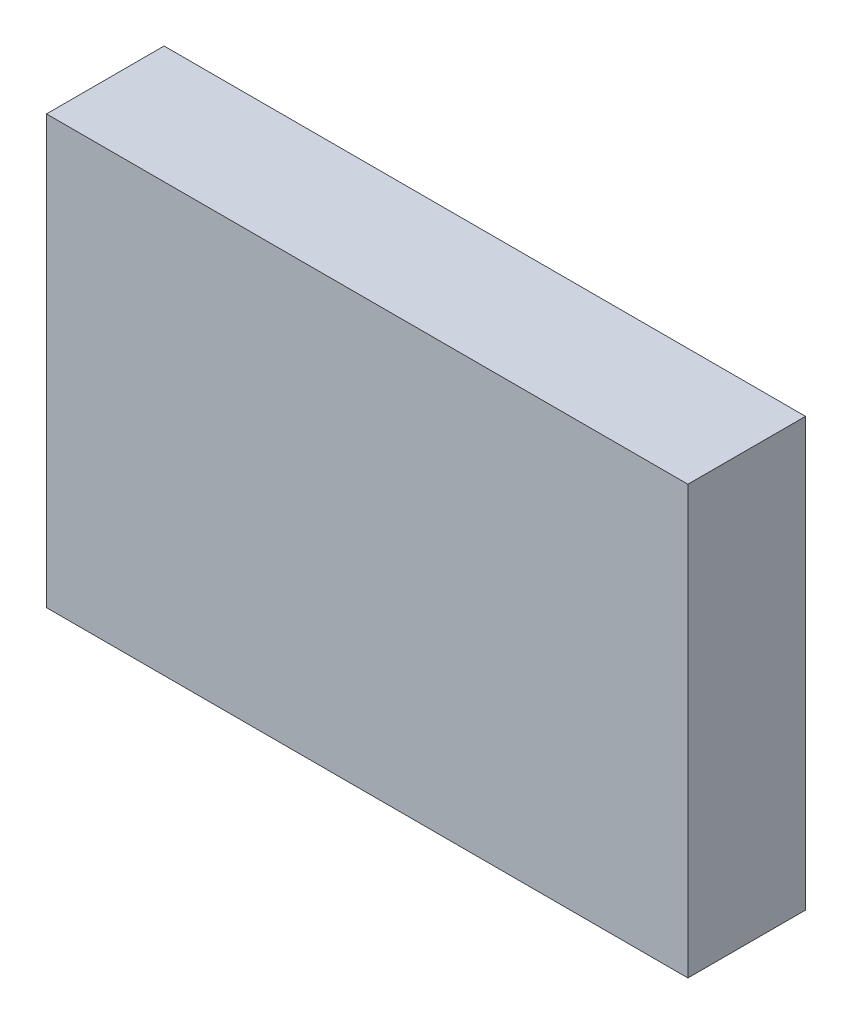
ISO-10303-21;
HEADER;
FILE_DESCRIPTION(('STEP AP214'),'2;1');
FILE_NAME('part.step','',(''),(''),'','','');
FILE_SCHEMA(('AUTOMOTIVE_DESIGN { 1 0 10303 214 1 1 1 1 }'));
ENDSEC;
DATA;
#1=APPLICATION_CONTEXT('core data for automotive mechanical design processes');
#2=APPLICATION_PROTOCOL_DEFINITION('international standard','automotive_design',2000,#1);
#3=PRODUCT_CONTEXT('',#1,'mechanical');
#4=PRODUCT('Part','Part','',(#3));
#5=PRODUCT_RELATED_PRODUCT_CATEGORY('part','',(#4));
#6=PRODUCT_DEFINITION_FORMATION('','',#4);
#7=PRODUCT_DEFINITION_CONTEXT('part definition',#1,'design');
#8=PRODUCT_DEFINITION('design','',#6,#7);
#9=PRODUCT_DEFINITION_SHAPE('','',#8);
#10=(LENGTH_UNIT() NAMED_UNIT(*) SI_UNIT(.MILLI.,.METRE.));
#11=(NAMED_UNIT(*) PLANE_ANGLE_UNIT() SI_UNIT($,.RADIAN.));
#12=(NAMED_UNIT(*) SI_UNIT($,.STERADIAN.) SOLID_ANGLE_UNIT());
#13=UNCERTAINTY_MEASURE_WITH_UNIT(LENGTH_MEASURE(1.E-05),#10,'distance_accuracy_value','');
#14=(GEOMETRIC_REPRESENTATION_CONTEXT(3) GLOBAL_UNCERTAINTY_ASSIGNED_CONTEXT((#13)) GLOBAL_UNIT_ASSIGNED_CONTEXT((#10,
#11,#12)) REPRESENTATION_CONTEXT('',''));
#15=CARTESIAN_POINT('',(0.,0.,0.));
#16=DIRECTION('',(0.,0.,1.));
#17=DIRECTION('',(1.,0.,0.));
#18=AXIS2_PLACEMENT_3D('',#15,#16,#17);
#19=CARTESIAN_POINT('',(1.50000208,1.00000054,0.5499989));
#20=DIRECTION('',(0.,0.,1.));
#21=DIRECTION('',(1.,0.,0.));
#22=AXIS2_PLACEMENT_3D('',#19,#20,#21);
#23=PLANE('',#22);
#24=DIRECTION('',(1.,0.,0.));
#25=VECTOR('',#24,1.);
#26=CARTESIAN_POINT('',(1.50000208,-0.999998,0.5499989));
#27=LINE('',#26,#25);
#28=CARTESIAN_POINT('',(1.50000208,-0.999998,0.5499989));
#29=VERTEX_POINT('',#28);
#30=CARTESIAN_POINT('',(-1.49999954,-0.999998,0.5499989));
#31=VERTEX_POINT('',#30);
#32=EDGE_CURVE('E53',#29,#31,#27,.F.);
#33=ORIENTED_EDGE('',*,*,#32,.F.);
#34=DIRECTION('',(0.,1.,0.));
#35=VECTOR('',#34,1.);
#36=CARTESIAN_POINT('',(1.50000208,1.00000054,0.5499989));
#37=LINE('',#36,#35);
#38=CARTESIAN_POINT('',(1.50000208,1.00000054,0.5499989));
#39=VERTEX_POINT('',#38);
#40=EDGE_CURVE('E68',#39,#29,#37,.F.);
#41=ORIENTED_EDGE('',*,*,#40,.F.);
#42=DIRECTION('',(1.,0.,0.));
#43=VECTOR('',#42,1.);
#44=CARTESIAN_POINT('',(-1.49999954,1.00000054,0.5499989));
#45=LINE('',#44,#43);
#46=CARTESIAN_POINT('',(-1.49999954,1.00000054,0.5499989));
#47=VERTEX_POINT('',#46);
#48=EDGE_CURVE('E20',#47,#39,#45,.T.);
#49=ORIENTED_EDGE('',*,*,#48,.F.);
#50=DIRECTION('',(0.,1.,0.));
#51=VECTOR('',#50,1.);
#52=CARTESIAN_POINT('',(-1.49999954,-0.999998,0.5499989));
#53=LINE('',#52,#51);
#54=EDGE_CURVE('E58',#31,#47,#53,.T.);
#55=ORIENTED_EDGE('',*,*,#54,.F.);
#56=EDGE_LOOP('',(#33,#41,#49,#55));
#57=FACE_BOUND('',#56,.T.);
#58=ADVANCED_FACE('F17',(#57),#23,.T.);
#59=CARTESIAN_POINT('',(-1.49999954,1.00000054,0.));
#60=DIRECTION('',(0.,1.,0.));
#61=DIRECTION('',(0.,0.,1.));
#62=AXIS2_PLACEMENT_3D('',#59,#60,#61);
#63=PLANE('',#62);
#64=DIRECTION('',(0.,0.,-1.));
#65=VECTOR('',#64,1.);
#66=CARTESIAN_POINT('',(1.50000208,1.00000054,0.));
#67=LINE('',#66,#65);
#68=CARTESIAN_POINT('',(1.50000208,1.00000054,0.));
#69=VERTEX_POINT('',#68);
#70=EDGE_CURVE('E79',#69,#39,#67,.F.);
#71=ORIENTED_EDGE('',*,*,#70,.F.);
#72=DIRECTION('',(1.,0.,0.));
#73=VECTOR('',#72,1.);
#74=CARTESIAN_POINT('',(1.50000208,1.00000054,0.));
#75=LINE('',#74,#73);
#76=CARTESIAN_POINT('',(-1.49999954,1.00000054,0.));
#77=VERTEX_POINT('',#76);
#78=EDGE_CURVE('E74',#69,#77,#75,.F.);
#79=ORIENTED_EDGE('',*,*,#78,.T.);
#80=DIRECTION('',(0.,0.,1.));
#81=VECTOR('',#80,1.);
#82=CARTESIAN_POINT('',(-1.49999954,1.00000054,0.));
#83=LINE('',#82,#81);
#84=EDGE_CURVE('E63',#47,#77,#83,.F.);
#85=ORIENTED_EDGE('',*,*,#84,.F.);
#86=ORIENTED_EDGE('',*,*,#48,.T.);
#87=EDGE_LOOP('',(#71,#79,#85,#86));
#88=FACE_BOUND('',#87,.T.);
#89=ADVANCED_FACE('F73',(#88),#63,.T.);
#90=CARTESIAN_POINT('',(-1.49999954,-0.999998,0.));
#91=DIRECTION('',(-1.,0.,0.));
#92=DIRECTION('',(0.,0.,1.));
#93=AXIS2_PLACEMENT_3D('',#90,#91,#92);
#94=PLANE('',#93);
#95=ORIENTED_EDGE('',*,*,#84,.T.);
#96=DIRECTION('',(0.,1.,0.));
#97=VECTOR('',#96,1.);
#98=CARTESIAN_POINT('',(-1.49999954,1.00000054,0.));
#99=LINE('',#98,#97);
#100=CARTESIAN_POINT('',(-1.49999954,-0.999998,0.));
#101=VERTEX_POINT('',#100);
#102=EDGE_CURVE('E84',#77,#101,#99,.F.);
#103=ORIENTED_EDGE('',*,*,#102,.T.);
#104=DIRECTION('',(0.,0.,-1.));
#105=VECTOR('',#104,1.);
#106=CARTESIAN_POINT('',(-1.49999954,-0.999998,0.));
#107=LINE('',#106,#105);
#108=EDGE_CURVE('E65',#31,#101,#107,.T.);
#109=ORIENTED_EDGE('',*,*,#108,.F.);
#110=ORIENTED_EDGE('',*,*,#54,.T.);
#111=EDGE_LOOP('',(#95,#103,#109,#110));
#112=FACE_BOUND('',#111,.T.);
#113=ADVANCED_FACE('F60',(#112),#94,.T.);
#114=CARTESIAN_POINT('',(1.50000208,-0.999998,0.));
#115=DIRECTION('',(0.,-1.,0.));
#116=DIRECTION('',(0.,0.,-1.));
#117=AXIS2_PLACEMENT_3D('',#114,#115,#116);
#118=PLANE('',#117);
#119=ORIENTED_EDGE('',*,*,#108,.T.);
#120=DIRECTION('',(1.,0.,0.));
#121=VECTOR('',#120,1.);
#122=CARTESIAN_POINT('',(1.50000208,-0.999998,0.));
#123=LINE('',#122,#121);
#124=CARTESIAN_POINT('',(1.50000208,-0.999998,0.));
#125=VERTEX_POINT('',#124);
#126=EDGE_CURVE('E26',#101,#125,#123,.T.);
#127=ORIENTED_EDGE('',*,*,#126,.T.);
#128=DIRECTION('',(0.,0.,-1.));
#129=VECTOR('',#128,1.);
#130=CARTESIAN_POINT('',(1.50000208,-0.999998,0.));
#131=LINE('',#130,#129);
#132=EDGE_CURVE('E34',#29,#125,#131,.T.);
#133=ORIENTED_EDGE('',*,*,#132,.F.);
#134=ORIENTED_EDGE('',*,*,#32,.T.);
#135=EDGE_LOOP('',(#119,#127,#133,#134));
#136=FACE_BOUND('',#135,.T.);
#137=ADVANCED_FACE('F88',(#136),#118,.T.);
#138=CARTESIAN_POINT('',(1.50000208,1.00000054,0.));
#139=DIRECTION('',(1.,0.,0.));
#140=DIRECTION('',(0.,0.,-1.));
#141=AXIS2_PLACEMENT_3D('',#138,#139,#140);
#142=PLANE('',#141);
#143=ORIENTED_EDGE('',*,*,#132,.T.);
#144=DIRECTION('',(0.,1.,0.));
#145=VECTOR('',#144,1.);
#146=CARTESIAN_POINT('',(1.50000208,1.00000054,0.));
#147=LINE('',#146,#145);
#148=EDGE_CURVE('E11',#125,#69,#147,.T.);
#149=ORIENTED_EDGE('',*,*,#148,.T.);
#150=ORIENTED_EDGE('',*,*,#70,.T.);
#151=ORIENTED_EDGE('',*,*,#40,.T.);
#152=EDGE_LOOP('',(#143,#149,#150,#151));
#153=FACE_BOUND('',#152,.T.);
#154=ADVANCED_FACE('F91',(#153),#142,.T.);
#155=CARTESIAN_POINT('',(1.50000208,1.00000054,0.));
#156=DIRECTION('',(0.,0.,1.));
#157=DIRECTION('',(1.,0.,0.));
#158=AXIS2_PLACEMENT_3D('',#155,#156,#157);
#159=PLANE('',#158);
#160=ORIENTED_EDGE('',*,*,#126,.F.);
#161=ORIENTED_EDGE('',*,*,#102,.F.);
#162=ORIENTED_EDGE('',*,*,#78,.F.);
#163=ORIENTED_EDGE('',*,*,#148,.F.);
#164=EDGE_LOOP('',(#160,#161,#162,#163));
#165=FACE_BOUND('',#164,.T.);
#166=ADVANCED_FACE('F90',(#165),#159,.F.);
#167=CLOSED_SHELL('',(#58,#89,#113,#137,#154,#166));
#168=MANIFOLD_SOLID_BREP('B1',#167);
#169=ADVANCED_BREP_SHAPE_REPRESENTATION('',(#18,#168),#14);
#170=SHAPE_DEFINITION_REPRESENTATION(#9,#169);
ENDSEC;
END-ISO-10303-21;
